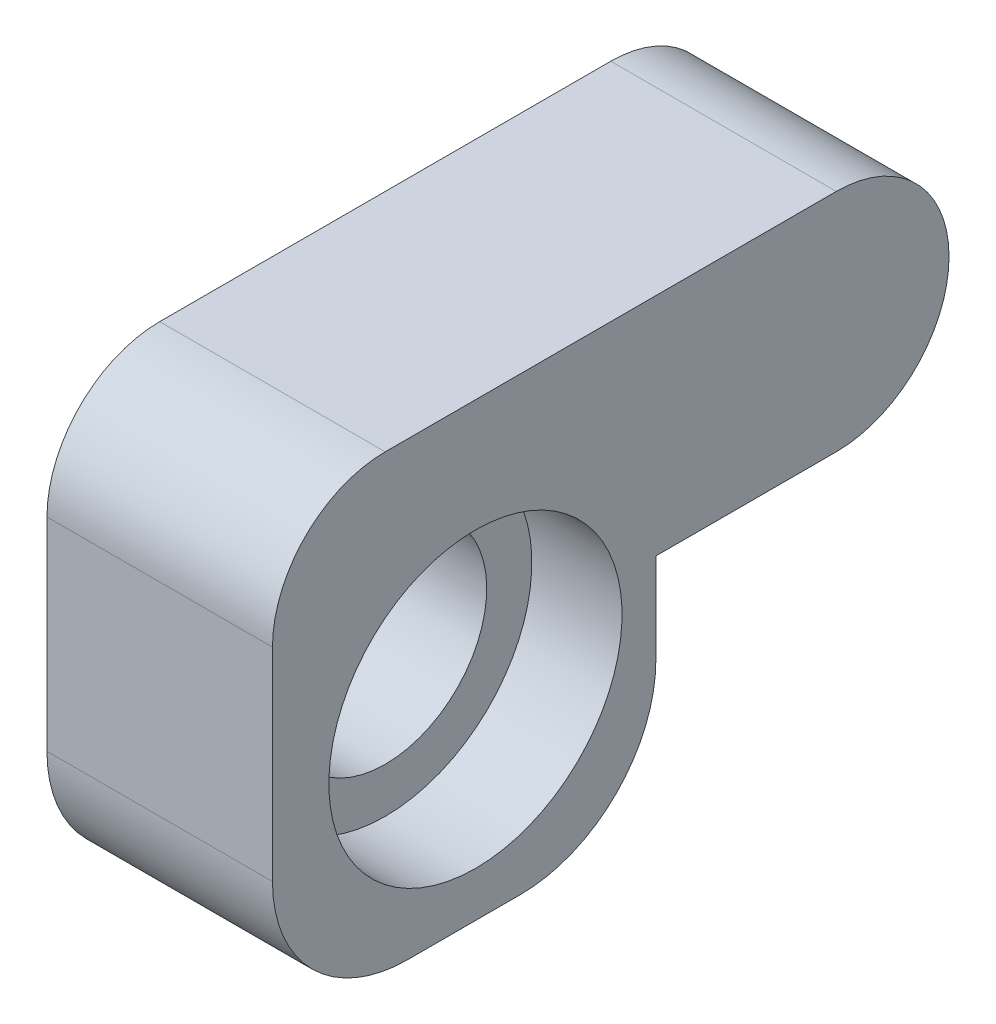
ISO-10303-21;
HEADER;
FILE_DESCRIPTION(('STEP AP214'),'2;1');
FILE_NAME('part.step','',(''),(''),'','','');
FILE_SCHEMA(('AUTOMOTIVE_DESIGN { 1 0 10303 214 1 1 1 1 }'));
ENDSEC;
DATA;
#1=APPLICATION_CONTEXT('core data for automotive mechanical design processes');
#2=APPLICATION_PROTOCOL_DEFINITION('international standard','automotive_design',2000,#1);
#3=PRODUCT_CONTEXT('',#1,'mechanical');
#4=PRODUCT('Part','Part','',(#3));
#5=PRODUCT_RELATED_PRODUCT_CATEGORY('part','',(#4));
#6=PRODUCT_DEFINITION_FORMATION('','',#4);
#7=PRODUCT_DEFINITION_CONTEXT('part definition',#1,'design');
#8=PRODUCT_DEFINITION('design','',#6,#7);
#9=PRODUCT_DEFINITION_SHAPE('','',#8);
#10=(LENGTH_UNIT() NAMED_UNIT(*) SI_UNIT(.MILLI.,.METRE.));
#11=(NAMED_UNIT(*) PLANE_ANGLE_UNIT() SI_UNIT($,.RADIAN.));
#12=(NAMED_UNIT(*) SI_UNIT($,.STERADIAN.) SOLID_ANGLE_UNIT());
#13=UNCERTAINTY_MEASURE_WITH_UNIT(LENGTH_MEASURE(1.E-05),#10,'distance_accuracy_value','');
#14=(GEOMETRIC_REPRESENTATION_CONTEXT(3) GLOBAL_UNCERTAINTY_ASSIGNED_CONTEXT((#13)) GLOBAL_UNIT_ASSIGNED_CONTEXT((#10,
#11,#12)) REPRESENTATION_CONTEXT('',''));
#15=CARTESIAN_POINT('',(0.,0.,0.));
#16=DIRECTION('',(0.,0.,1.));
#17=DIRECTION('',(1.,0.,0.));
#18=AXIS2_PLACEMENT_3D('',#15,#16,#17);
#19=CARTESIAN_POINT('',(19.,0.,0.));
#20=DIRECTION('',(1.,0.,0.));
#21=DIRECTION('',(0.,1.,0.));
#22=AXIS2_PLACEMENT_3D('',#19,#20,#21);
#23=PLANE('',#22);
#24=CARTESIAN_POINT('',(19.,8.5,67.5));
#25=DIRECTION('',(-1.,0.,0.));
#26=DIRECTION('',(0.,-1.,0.));
#27=AXIS2_PLACEMENT_3D('',#24,#25,#26);
#28=CIRCLE('',#27,6.5);
#29=CARTESIAN_POINT('',(19.,2.,67.5));
#30=VERTEX_POINT('',#29);
#31=EDGE_CURVE('E202',#30,#30,#28,.T.);
#32=ORIENTED_EDGE('',*,*,#31,.T.);
#33=EDGE_LOOP('',(#32));
#34=FACE_BOUND('',#33,.T.);
#35=DIRECTION('',(0.,0.,-1.));
#36=VECTOR('',#35,1.);
#37=CARTESIAN_POINT('',(19.,10.,59.5));
#38=LINE('',#37,#36);
#39=CARTESIAN_POINT('',(19.,10.,59.5));
#40=VERTEX_POINT('',#39);
#41=CARTESIAN_POINT('',(19.,10.,51.5));
#42=VERTEX_POINT('',#41);
#43=EDGE_CURVE('E116',#40,#42,#38,.T.);
#44=ORIENTED_EDGE('',*,*,#43,.T.);
#45=CARTESIAN_POINT('',(19.,15.,51.5));
#46=DIRECTION('',(1.,0.,0.));
#47=DIRECTION('',(0.,1.,0.));
#48=AXIS2_PLACEMENT_3D('',#45,#46,#47);
#49=CIRCLE('',#48,5.);
#50=CARTESIAN_POINT('',(19.,15.,46.5));
#51=VERTEX_POINT('',#50);
#52=EDGE_CURVE('E185',#42,#51,#49,.T.);
#53=ORIENTED_EDGE('',*,*,#52,.T.);
#54=CARTESIAN_POINT('',(19.,15.,51.5));
#55=DIRECTION('',(1.,0.,0.));
#56=DIRECTION('',(0.,1.,0.));
#57=AXIS2_PLACEMENT_3D('',#54,#55,#56);
#58=CIRCLE('',#57,5.);
#59=CARTESIAN_POINT('',(19.,20.,51.5));
#60=VERTEX_POINT('',#59);
#61=EDGE_CURVE('E58',#51,#60,#58,.T.);
#62=ORIENTED_EDGE('',*,*,#61,.T.);
#63=DIRECTION('',(0.,0.,1.));
#64=VECTOR('',#63,1.);
#65=CARTESIAN_POINT('',(19.,20.,46.5));
#66=LINE('',#65,#64);
#67=CARTESIAN_POINT('',(19.,20.,71.5));
#68=VERTEX_POINT('',#67);
#69=EDGE_CURVE('E152',#60,#68,#66,.T.);
#70=ORIENTED_EDGE('',*,*,#69,.T.);
#71=CARTESIAN_POINT('',(19.,15.,71.5));
#72=DIRECTION('',(1.,0.,0.));
#73=DIRECTION('',(0.,1.,0.));
#74=AXIS2_PLACEMENT_3D('',#71,#72,#73);
#75=CIRCLE('',#74,5.);
#76=CARTESIAN_POINT('',(19.,15.,76.5));
#77=VERTEX_POINT('',#76);
#78=EDGE_CURVE('E182',#68,#77,#75,.T.);
#79=ORIENTED_EDGE('',*,*,#78,.T.);
#80=DIRECTION('',(0.,-1.,0.));
#81=VECTOR('',#80,1.);
#82=CARTESIAN_POINT('',(19.,20.,76.5));
#83=LINE('',#82,#81);
#84=CARTESIAN_POINT('',(19.,6.,76.5));
#85=VERTEX_POINT('',#84);
#86=EDGE_CURVE('E331',#77,#85,#83,.T.);
#87=ORIENTED_EDGE('',*,*,#86,.T.);
#88=CARTESIAN_POINT('',(19.,6.,70.5));
#89=DIRECTION('',(1.,0.,0.));
#90=DIRECTION('',(0.,1.,0.));
#91=AXIS2_PLACEMENT_3D('',#88,#89,#90);
#92=CIRCLE('',#91,6.);
#93=CARTESIAN_POINT('',(19.,0.,70.5));
#94=VERTEX_POINT('',#93);
#95=EDGE_CURVE('E171',#85,#94,#92,.T.);
#96=ORIENTED_EDGE('',*,*,#95,.T.);
#97=DIRECTION('',(0.,0.,-1.));
#98=VECTOR('',#97,1.);
#99=CARTESIAN_POINT('',(19.,0.,76.5));
#100=LINE('',#99,#98);
#101=CARTESIAN_POINT('',(19.,0.,65.5));
#102=VERTEX_POINT('',#101);
#103=EDGE_CURVE('E123',#94,#102,#100,.T.);
#104=ORIENTED_EDGE('',*,*,#103,.T.);
#105=CARTESIAN_POINT('',(19.,6.,65.5));
#106=DIRECTION('',(1.,0.,0.));
#107=DIRECTION('',(0.,1.,0.));
#108=AXIS2_PLACEMENT_3D('',#105,#106,#107);
#109=CIRCLE('',#108,6.);
#110=CARTESIAN_POINT('',(19.,6.,59.5));
#111=VERTEX_POINT('',#110);
#112=EDGE_CURVE('E119',#102,#111,#109,.T.);
#113=ORIENTED_EDGE('',*,*,#112,.T.);
#114=DIRECTION('',(0.,1.,0.));
#115=VECTOR('',#114,1.);
#116=CARTESIAN_POINT('',(19.,0.,59.5));
#117=LINE('',#116,#115);
#118=EDGE_CURVE('E113',#111,#40,#117,.T.);
#119=ORIENTED_EDGE('',*,*,#118,.T.);
#120=EDGE_LOOP('',(#44,#53,#62,#70,#79,#87,#96,#104,#113,#119));
#121=FACE_BOUND('',#120,.T.);
#122=ADVANCED_FACE('F35',(#34,#121),#23,.T.);
#123=CARTESIAN_POINT('',(9.,0.,0.));
#124=DIRECTION('',(1.,0.,0.));
#125=DIRECTION('',(0.,1.,0.));
#126=AXIS2_PLACEMENT_3D('',#123,#124,#125);
#127=PLANE('',#126);
#128=CARTESIAN_POINT('',(9.,15.,51.5));
#129=DIRECTION('',(1.,0.,0.));
#130=DIRECTION('',(0.,1.,0.));
#131=AXIS2_PLACEMENT_3D('',#128,#129,#130);
#132=CIRCLE('',#131,5.);
#133=CARTESIAN_POINT('',(9.,20.,51.5));
#134=VERTEX_POINT('',#133);
#135=CARTESIAN_POINT('',(9.,15.,46.5));
#136=VERTEX_POINT('',#135);
#137=EDGE_CURVE('E177',#134,#136,#132,.F.);
#138=ORIENTED_EDGE('',*,*,#137,.T.);
#139=CARTESIAN_POINT('',(9.,15.,51.5));
#140=DIRECTION('',(1.,0.,0.));
#141=DIRECTION('',(0.,1.,0.));
#142=AXIS2_PLACEMENT_3D('',#139,#140,#141);
#143=CIRCLE('',#142,5.);
#144=CARTESIAN_POINT('',(9.,10.,51.5));
#145=VERTEX_POINT('',#144);
#146=EDGE_CURVE('E179',#136,#145,#143,.F.);
#147=ORIENTED_EDGE('',*,*,#146,.T.);
#148=DIRECTION('',(0.,0.,-1.));
#149=VECTOR('',#148,1.);
#150=CARTESIAN_POINT('',(9.,10.,59.5));
#151=LINE('',#150,#149);
#152=CARTESIAN_POINT('',(9.,10.,59.5));
#153=VERTEX_POINT('',#152);
#154=EDGE_CURVE('E151',#153,#145,#151,.T.);
#155=ORIENTED_EDGE('',*,*,#154,.F.);
#156=DIRECTION('',(0.,1.,0.));
#157=VECTOR('',#156,1.);
#158=CARTESIAN_POINT('',(9.,0.,59.5));
#159=LINE('',#158,#157);
#160=CARTESIAN_POINT('',(9.,6.,59.5));
#161=VERTEX_POINT('',#160);
#162=EDGE_CURVE('E129',#161,#153,#159,.T.);
#163=ORIENTED_EDGE('',*,*,#162,.F.);
#164=CARTESIAN_POINT('',(9.,6.,65.5));
#165=DIRECTION('',(1.,0.,0.));
#166=DIRECTION('',(0.,1.,0.));
#167=AXIS2_PLACEMENT_3D('',#164,#165,#166);
#168=CIRCLE('',#167,6.);
#169=CARTESIAN_POINT('',(9.,0.,65.5));
#170=VERTEX_POINT('',#169);
#171=EDGE_CURVE('E162',#161,#170,#168,.F.);
#172=ORIENTED_EDGE('',*,*,#171,.T.);
#173=DIRECTION('',(0.,0.,-1.));
#174=VECTOR('',#173,1.);
#175=CARTESIAN_POINT('',(9.,0.,76.5));
#176=LINE('',#175,#174);
#177=CARTESIAN_POINT('',(9.,0.,70.5));
#178=VERTEX_POINT('',#177);
#179=EDGE_CURVE('E147',#178,#170,#176,.T.);
#180=ORIENTED_EDGE('',*,*,#179,.F.);
#181=CARTESIAN_POINT('',(9.,6.,70.5));
#182=DIRECTION('',(1.,0.,0.));
#183=DIRECTION('',(0.,1.,0.));
#184=AXIS2_PLACEMENT_3D('',#181,#182,#183);
#185=CIRCLE('',#184,6.);
#186=CARTESIAN_POINT('',(9.,6.,76.5));
#187=VERTEX_POINT('',#186);
#188=EDGE_CURVE('E164',#178,#187,#185,.F.);
#189=ORIENTED_EDGE('',*,*,#188,.T.);
#190=DIRECTION('',(0.,-1.,0.));
#191=VECTOR('',#190,1.);
#192=CARTESIAN_POINT('',(9.,20.,76.5));
#193=LINE('',#192,#191);
#194=CARTESIAN_POINT('',(9.,15.,76.5));
#195=VERTEX_POINT('',#194);
#196=EDGE_CURVE('E144',#195,#187,#193,.T.);
#197=ORIENTED_EDGE('',*,*,#196,.F.);
#198=CARTESIAN_POINT('',(9.,15.,71.5));
#199=DIRECTION('',(1.,0.,0.));
#200=DIRECTION('',(0.,1.,0.));
#201=AXIS2_PLACEMENT_3D('',#198,#199,#200);
#202=CIRCLE('',#201,5.);
#203=CARTESIAN_POINT('',(9.,20.,71.5));
#204=VERTEX_POINT('',#203);
#205=EDGE_CURVE('E175',#195,#204,#202,.F.);
#206=ORIENTED_EDGE('',*,*,#205,.T.);
#207=DIRECTION('',(0.,0.,1.));
#208=VECTOR('',#207,1.);
#209=CARTESIAN_POINT('',(9.,20.,46.5));
#210=LINE('',#209,#208);
#211=EDGE_CURVE('E142',#134,#204,#210,.T.);
#212=ORIENTED_EDGE('',*,*,#211,.F.);
#213=EDGE_LOOP('',(#138,#147,#155,#163,#172,#180,#189,#197,#206,#212));
#214=FACE_BOUND('',#213,.T.);
#215=CARTESIAN_POINT('',(9.,8.5,67.5));
#216=DIRECTION('',(1.,0.,0.));
#217=DIRECTION('',(0.,1.,0.));
#218=AXIS2_PLACEMENT_3D('',#215,#216,#217);
#219=CIRCLE('',#218,4.5);
#220=CARTESIAN_POINT('',(9.,13.,67.5));
#221=VERTEX_POINT('',#220);
#222=EDGE_CURVE('E145',#221,#221,#219,.T.);
#223=ORIENTED_EDGE('',*,*,#222,.T.);
#224=EDGE_LOOP('',(#223));
#225=FACE_BOUND('',#224,.T.);
#226=ADVANCED_FACE('F194',(#214,#225),#127,.F.);
#227=CARTESIAN_POINT('',(19.,20.,46.5));
#228=DIRECTION('',(0.,-1.,0.));
#229=DIRECTION('',(1.,0.,0.));
#230=AXIS2_PLACEMENT_3D('',#227,#228,#229);
#231=PLANE('',#230);
#232=ORIENTED_EDGE('',*,*,#69,.F.);
#233=DIRECTION('',(-1.,0.,0.));
#234=VECTOR('',#233,1.);
#235=CARTESIAN_POINT('',(19.,20.,51.5));
#236=LINE('',#235,#234);
#237=EDGE_CURVE('E44',#60,#134,#236,.T.);
#238=ORIENTED_EDGE('',*,*,#237,.T.);
#239=ORIENTED_EDGE('',*,*,#211,.T.);
#240=DIRECTION('',(-1.,0.,0.));
#241=VECTOR('',#240,1.);
#242=CARTESIAN_POINT('',(19.,20.,71.5));
#243=LINE('',#242,#241);
#244=EDGE_CURVE('E51',#204,#68,#243,.F.);
#245=ORIENTED_EDGE('',*,*,#244,.T.);
#246=EDGE_LOOP('',(#232,#238,#239,#245));
#247=FACE_BOUND('',#246,.T.);
#248=ADVANCED_FACE('F190',(#247),#231,.F.);
#249=CARTESIAN_POINT('',(19.,20.,76.5));
#250=DIRECTION('',(0.,0.,-1.));
#251=DIRECTION('',(-1.,0.,0.));
#252=AXIS2_PLACEMENT_3D('',#249,#250,#251);
#253=PLANE('',#252);
#254=ORIENTED_EDGE('',*,*,#86,.F.);
#255=DIRECTION('',(-1.,0.,0.));
#256=VECTOR('',#255,1.);
#257=CARTESIAN_POINT('',(19.,15.,76.5));
#258=LINE('',#257,#256);
#259=EDGE_CURVE('E11',#77,#195,#258,.T.);
#260=ORIENTED_EDGE('',*,*,#259,.T.);
#261=ORIENTED_EDGE('',*,*,#196,.T.);
#262=DIRECTION('',(-1.,0.,0.));
#263=VECTOR('',#262,1.);
#264=CARTESIAN_POINT('',(19.,6.,76.5));
#265=LINE('',#264,#263);
#266=EDGE_CURVE('E167',#187,#85,#265,.F.);
#267=ORIENTED_EDGE('',*,*,#266,.T.);
#268=EDGE_LOOP('',(#254,#260,#261,#267));
#269=FACE_BOUND('',#268,.T.);
#270=ADVANCED_FACE('F241',(#269),#253,.F.);
#271=CARTESIAN_POINT('',(19.,0.,76.5));
#272=DIRECTION('',(0.,1.,0.));
#273=DIRECTION('',(-1.,0.,0.));
#274=AXIS2_PLACEMENT_3D('',#271,#272,#273);
#275=PLANE('',#274);
#276=ORIENTED_EDGE('',*,*,#103,.F.);
#277=DIRECTION('',(-1.,0.,0.));
#278=VECTOR('',#277,1.);
#279=CARTESIAN_POINT('',(19.,0.,70.5));
#280=LINE('',#279,#278);
#281=EDGE_CURVE('E159',#94,#178,#280,.T.);
#282=ORIENTED_EDGE('',*,*,#281,.T.);
#283=ORIENTED_EDGE('',*,*,#179,.T.);
#284=DIRECTION('',(-1.,0.,0.));
#285=VECTOR('',#284,1.);
#286=CARTESIAN_POINT('',(19.,0.,65.5));
#287=LINE('',#286,#285);
#288=EDGE_CURVE('E133',#170,#102,#287,.F.);
#289=ORIENTED_EDGE('',*,*,#288,.T.);
#290=EDGE_LOOP('',(#276,#282,#283,#289));
#291=FACE_BOUND('',#290,.T.);
#292=ADVANCED_FACE('F209',(#291),#275,.F.);
#293=CARTESIAN_POINT('',(19.,0.,59.5));
#294=DIRECTION('',(0.,0.,1.));
#295=DIRECTION('',(1.,0.,0.));
#296=AXIS2_PLACEMENT_3D('',#293,#294,#295);
#297=PLANE('',#296);
#298=ORIENTED_EDGE('',*,*,#118,.F.);
#299=DIRECTION('',(-1.,0.,0.));
#300=VECTOR('',#299,1.);
#301=CARTESIAN_POINT('',(19.,6.,59.5));
#302=LINE('',#301,#300);
#303=EDGE_CURVE('E173',#111,#161,#302,.T.);
#304=ORIENTED_EDGE('',*,*,#303,.T.);
#305=ORIENTED_EDGE('',*,*,#162,.T.);
#306=DIRECTION('',(-1.,0.,0.));
#307=VECTOR('',#306,1.);
#308=CARTESIAN_POINT('',(19.,10.,59.5));
#309=LINE('',#308,#307);
#310=EDGE_CURVE('E126',#40,#153,#309,.T.);
#311=ORIENTED_EDGE('',*,*,#310,.F.);
#312=EDGE_LOOP('',(#298,#304,#305,#311));
#313=FACE_BOUND('',#312,.T.);
#314=ADVANCED_FACE('F127',(#313),#297,.F.);
#315=CARTESIAN_POINT('',(19.,10.,59.5));
#316=DIRECTION('',(0.,1.,0.));
#317=DIRECTION('',(-1.,0.,0.));
#318=AXIS2_PLACEMENT_3D('',#315,#316,#317);
#319=PLANE('',#318);
#320=ORIENTED_EDGE('',*,*,#154,.T.);
#321=DIRECTION('',(-1.,0.,0.));
#322=VECTOR('',#321,1.);
#323=CARTESIAN_POINT('',(19.,10.,51.5));
#324=LINE('',#323,#322);
#325=EDGE_CURVE('E138',#145,#42,#324,.F.);
#326=ORIENTED_EDGE('',*,*,#325,.T.);
#327=ORIENTED_EDGE('',*,*,#43,.F.);
#328=ORIENTED_EDGE('',*,*,#310,.T.);
#329=EDGE_LOOP('',(#320,#326,#327,#328));
#330=FACE_BOUND('',#329,.T.);
#331=ADVANCED_FACE('F136',(#330),#319,.F.);
#332=CARTESIAN_POINT('',(19.,8.5,67.5));
#333=DIRECTION('',(-1.,0.,0.));
#334=DIRECTION('',(0.,-1.,0.));
#335=AXIS2_PLACEMENT_3D('',#332,#333,#334);
#336=CYLINDRICAL_SURFACE('',#335,4.5);
#337=CARTESIAN_POINT('',(15.,8.5,67.5));
#338=DIRECTION('',(-1.,0.,0.));
#339=DIRECTION('',(0.,-1.,0.));
#340=AXIS2_PLACEMENT_3D('',#337,#338,#339);
#341=CIRCLE('',#340,4.5);
#342=CARTESIAN_POINT('',(15.,4.,67.5));
#343=VERTEX_POINT('',#342);
#344=EDGE_CURVE('E154',#343,#343,#341,.T.);
#345=ORIENTED_EDGE('',*,*,#344,.F.);
#346=EDGE_LOOP('',(#345));
#347=FACE_BOUND('',#346,.T.);
#348=ORIENTED_EDGE('',*,*,#222,.F.);
#349=EDGE_LOOP('',(#348));
#350=FACE_BOUND('',#349,.T.);
#351=ADVANCED_FACE('F232',(#347,#350),#336,.F.);
#352=CARTESIAN_POINT('',(15.,8.5,67.5));
#353=DIRECTION('',(1.,0.,0.));
#354=DIRECTION('',(0.,1.,0.));
#355=AXIS2_PLACEMENT_3D('',#352,#353,#354);
#356=CYLINDRICAL_SURFACE('',#355,6.5);
#357=CARTESIAN_POINT('',(15.,8.5,67.5));
#358=DIRECTION('',(-1.,0.,0.));
#359=DIRECTION('',(0.,-1.,0.));
#360=AXIS2_PLACEMENT_3D('',#357,#358,#359);
#361=CIRCLE('',#360,6.5);
#362=CARTESIAN_POINT('',(15.,2.,67.5));
#363=VERTEX_POINT('',#362);
#364=EDGE_CURVE('E157',#363,#363,#361,.T.);
#365=ORIENTED_EDGE('',*,*,#364,.T.);
#366=EDGE_LOOP('',(#365));
#367=FACE_BOUND('',#366,.T.);
#368=ORIENTED_EDGE('',*,*,#31,.F.);
#369=EDGE_LOOP('',(#368));
#370=FACE_BOUND('',#369,.T.);
#371=ADVANCED_FACE('F277',(#367,#370),#356,.F.);
#372=CARTESIAN_POINT('',(15.,8.5,67.5));
#373=DIRECTION('',(-1.,0.,0.));
#374=DIRECTION('',(0.,-1.,0.));
#375=AXIS2_PLACEMENT_3D('',#372,#373,#374);
#376=PLANE('',#375);
#377=ORIENTED_EDGE('',*,*,#344,.T.);
#378=EDGE_LOOP('',(#377));
#379=FACE_BOUND('',#378,.T.);
#380=ORIENTED_EDGE('',*,*,#364,.F.);
#381=EDGE_LOOP('',(#380));
#382=FACE_BOUND('',#381,.T.);
#383=ADVANCED_FACE('F219',(#379,#382),#376,.F.);
#384=CARTESIAN_POINT('',(19.,6.,70.5));
#385=DIRECTION('',(-1.,0.,0.));
#386=DIRECTION('',(0.,-1.,0.));
#387=AXIS2_PLACEMENT_3D('',#384,#385,#386);
#388=CYLINDRICAL_SURFACE('',#387,6.);
#389=ORIENTED_EDGE('',*,*,#95,.F.);
#390=ORIENTED_EDGE('',*,*,#266,.F.);
#391=ORIENTED_EDGE('',*,*,#188,.F.);
#392=ORIENTED_EDGE('',*,*,#281,.F.);
#393=EDGE_LOOP('',(#389,#390,#391,#392));
#394=FACE_BOUND('',#393,.T.);
#395=ADVANCED_FACE('F213',(#394),#388,.T.);
#396=CARTESIAN_POINT('',(19.,6.,65.5));
#397=DIRECTION('',(-1.,0.,0.));
#398=DIRECTION('',(0.,-1.,0.));
#399=AXIS2_PLACEMENT_3D('',#396,#397,#398);
#400=CYLINDRICAL_SURFACE('',#399,6.);
#401=ORIENTED_EDGE('',*,*,#112,.F.);
#402=ORIENTED_EDGE('',*,*,#288,.F.);
#403=ORIENTED_EDGE('',*,*,#171,.F.);
#404=ORIENTED_EDGE('',*,*,#303,.F.);
#405=EDGE_LOOP('',(#401,#402,#403,#404));
#406=FACE_BOUND('',#405,.T.);
#407=ADVANCED_FACE('F211',(#406),#400,.T.);
#408=CARTESIAN_POINT('',(19.,15.,51.5));
#409=DIRECTION('',(-1.,0.,0.));
#410=DIRECTION('',(0.,-1.,0.));
#411=AXIS2_PLACEMENT_3D('',#408,#409,#410);
#412=CYLINDRICAL_SURFACE('',#411,5.);
#413=ORIENTED_EDGE('',*,*,#237,.F.);
#414=ORIENTED_EDGE('',*,*,#61,.F.);
#415=DIRECTION('',(-1.,0.,0.));
#416=VECTOR('',#415,1.);
#417=CARTESIAN_POINT('',(19.,15.,46.5));
#418=LINE('',#417,#416);
#419=EDGE_CURVE('E39',#136,#51,#418,.F.);
#420=ORIENTED_EDGE('',*,*,#419,.F.);
#421=ORIENTED_EDGE('',*,*,#137,.F.);
#422=EDGE_LOOP('',(#413,#414,#420,#421));
#423=FACE_BOUND('',#422,.T.);
#424=ADVANCED_FACE('F198',(#423),#412,.T.);
#425=CARTESIAN_POINT('',(19.,15.,51.5));
#426=DIRECTION('',(-1.,0.,0.));
#427=DIRECTION('',(0.,-1.,0.));
#428=AXIS2_PLACEMENT_3D('',#425,#426,#427);
#429=CYLINDRICAL_SURFACE('',#428,5.);
#430=ORIENTED_EDGE('',*,*,#52,.F.);
#431=ORIENTED_EDGE('',*,*,#325,.F.);
#432=ORIENTED_EDGE('',*,*,#146,.F.);
#433=ORIENTED_EDGE('',*,*,#419,.T.);
#434=EDGE_LOOP('',(#430,#431,#432,#433));
#435=FACE_BOUND('',#434,.T.);
#436=ADVANCED_FACE('F203',(#435),#429,.T.);
#437=CARTESIAN_POINT('',(19.,15.,71.5));
#438=DIRECTION('',(-1.,0.,0.));
#439=DIRECTION('',(0.,-1.,0.));
#440=AXIS2_PLACEMENT_3D('',#437,#438,#439);
#441=CYLINDRICAL_SURFACE('',#440,5.);
#442=ORIENTED_EDGE('',*,*,#78,.F.);
#443=ORIENTED_EDGE('',*,*,#244,.F.);
#444=ORIENTED_EDGE('',*,*,#205,.F.);
#445=ORIENTED_EDGE('',*,*,#259,.F.);
#446=EDGE_LOOP('',(#442,#443,#444,#445));
#447=FACE_BOUND('',#446,.T.);
#448=ADVANCED_FACE('F37',(#447),#441,.T.);
#449=CLOSED_SHELL('',(#122,#226,#248,#270,#292,#314,#331,#351,#371,#383,#395,#407,#424,#436,#448));
#450=MANIFOLD_SOLID_BREP('B2',#449);
#451=ADVANCED_BREP_SHAPE_REPRESENTATION('',(#18,#450),#14);
#452=SHAPE_DEFINITION_REPRESENTATION(#9,#451);
ENDSEC;
END-ISO-10303-21;
